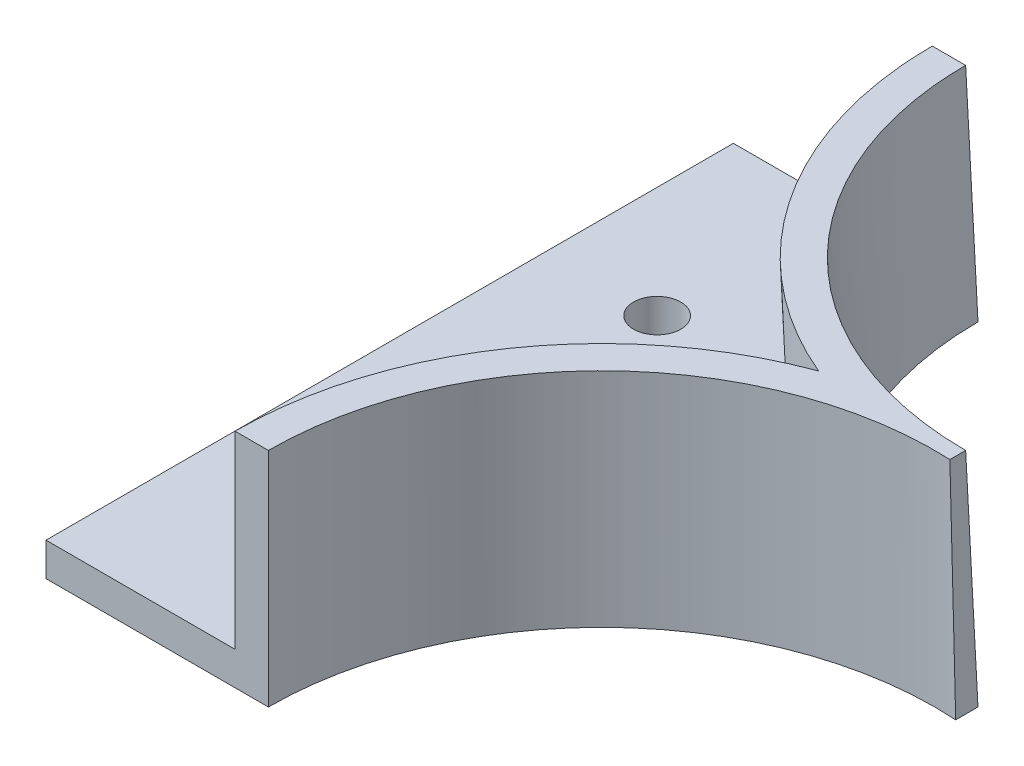
ISO-10303-21;
HEADER;
FILE_DESCRIPTION(('STEP AP214'),'2;1');
FILE_NAME('part.step','',(''),(''),'','','');
FILE_SCHEMA(('AUTOMOTIVE_DESIGN { 1 0 10303 214 1 1 1 1 }'));
ENDSEC;
DATA;
#1=APPLICATION_CONTEXT('core data for automotive mechanical design processes');
#2=APPLICATION_PROTOCOL_DEFINITION('international standard','automotive_design',2000,#1);
#3=PRODUCT_CONTEXT('',#1,'mechanical');
#4=PRODUCT('Part','Part','',(#3));
#5=PRODUCT_RELATED_PRODUCT_CATEGORY('part','',(#4));
#6=PRODUCT_DEFINITION_FORMATION('','',#4);
#7=PRODUCT_DEFINITION_CONTEXT('part definition',#1,'design');
#8=PRODUCT_DEFINITION('design','',#6,#7);
#9=PRODUCT_DEFINITION_SHAPE('','',#8);
#10=(LENGTH_UNIT() NAMED_UNIT(*) SI_UNIT(.MILLI.,.METRE.));
#11=(NAMED_UNIT(*) PLANE_ANGLE_UNIT() SI_UNIT($,.RADIAN.));
#12=(NAMED_UNIT(*) SI_UNIT($,.STERADIAN.) SOLID_ANGLE_UNIT());
#13=UNCERTAINTY_MEASURE_WITH_UNIT(LENGTH_MEASURE(1.E-05),#10,'distance_accuracy_value','');
#14=(GEOMETRIC_REPRESENTATION_CONTEXT(3) GLOBAL_UNCERTAINTY_ASSIGNED_CONTEXT((#13)) GLOBAL_UNIT_ASSIGNED_CONTEXT((#10,
#11,#12)) REPRESENTATION_CONTEXT('',''));
#15=CARTESIAN_POINT('',(0.,0.,0.));
#16=DIRECTION('',(0.,0.,1.));
#17=DIRECTION('',(1.,0.,0.));
#18=AXIS2_PLACEMENT_3D('',#15,#16,#17);
#19=CARTESIAN_POINT('',(0.,70.,-30.));
#20=DIRECTION('',(1.,0.,0.));
#21=DIRECTION('',(0.,0.,-1.));
#22=AXIS2_PLACEMENT_3D('',#19,#20,#21);
#23=PLANE('',#22);
#24=DIRECTION('',(0.,0.,1.));
#25=VECTOR('',#24,1.);
#26=CARTESIAN_POINT('',(0.,3.,-30.));
#27=LINE('',#26,#25);
#28=CARTESIAN_POINT('',(0.,3.,-31.8609469555459));
#29=VERTEX_POINT('',#28);
#30=CARTESIAN_POINT('',(0.,3.,30.));
#31=VERTEX_POINT('',#30);
#32=EDGE_CURVE('E129',#29,#31,#27,.T.);
#33=ORIENTED_EDGE('',*,*,#32,.F.);
#34=DIRECTION('',(0.,0.999614488628896,0.027764619990052));
#35=VECTOR('',#34,1.);
#36=CARTESIAN_POINT('',(0.,70.,-30.));
#37=LINE('',#36,#35);
#38=CARTESIAN_POINT('',(0.,0.,-31.94427293863));
#39=VERTEX_POINT('',#38);
#40=EDGE_CURVE('E178',#29,#39,#37,.F.);
#41=ORIENTED_EDGE('',*,*,#40,.T.);
#42=DIRECTION('',(0.,0.,1.));
#43=VECTOR('',#42,1.);
#44=CARTESIAN_POINT('',(0.,0.,-30.));
#45=LINE('',#44,#43);
#46=CARTESIAN_POINT('',(0.,0.,30.));
#47=VERTEX_POINT('',#46);
#48=EDGE_CURVE('E166',#39,#47,#45,.T.);
#49=ORIENTED_EDGE('',*,*,#48,.T.);
#50=DIRECTION('',(0.,-1.,0.));
#51=VECTOR('',#50,1.);
#52=CARTESIAN_POINT('',(0.,70.,30.));
#53=LINE('',#52,#51);
#54=EDGE_CURVE('E175',#31,#47,#53,.T.);
#55=ORIENTED_EDGE('',*,*,#54,.F.);
#56=EDGE_LOOP('',(#33,#41,#49,#55));
#57=FACE_BOUND('',#56,.T.);
#58=ADVANCED_FACE('F39',(#57),#23,.F.);
#59=CARTESIAN_POINT('',(0.,70.,30.));
#60=DIRECTION('',(0.,0.,-1.));
#61=DIRECTION('',(-1.,0.,0.));
#62=AXIS2_PLACEMENT_3D('',#59,#60,#61);
#63=PLANE('',#62);
#64=DIRECTION('',(0.,1.,0.));
#65=VECTOR('',#64,1.);
#66=CARTESIAN_POINT('',(17.0115608842805,0.,30.));
#67=LINE('',#66,#65);
#68=CARTESIAN_POINT('',(17.0115608842805,3.,30.));
#69=VERTEX_POINT('',#68);
#70=CARTESIAN_POINT('',(17.0115608842805,20.,30.));
#71=VERTEX_POINT('',#70);
#72=EDGE_CURVE('E130',#69,#71,#67,.T.);
#73=ORIENTED_EDGE('',*,*,#72,.F.);
#74=DIRECTION('',(1.,0.,0.));
#75=VECTOR('',#74,1.);
#76=CARTESIAN_POINT('',(0.,3.,30.));
#77=LINE('',#76,#75);
#78=EDGE_CURVE('E210',#31,#69,#77,.T.);
#79=ORIENTED_EDGE('',*,*,#78,.F.);
#80=ORIENTED_EDGE('',*,*,#54,.T.);
#81=DIRECTION('',(1.,0.,0.));
#82=VECTOR('',#81,1.);
#83=CARTESIAN_POINT('',(0.,0.,30.));
#84=LINE('',#83,#82);
#85=CARTESIAN_POINT('',(20.0115608842805,0.,30.));
#86=VERTEX_POINT('',#85);
#87=EDGE_CURVE('E170',#47,#86,#84,.T.);
#88=ORIENTED_EDGE('',*,*,#87,.T.);
#89=DIRECTION('',(0.,1.,0.));
#90=VECTOR('',#89,1.);
#91=CARTESIAN_POINT('',(20.0115608842805,0.,30.));
#92=LINE('',#91,#90);
#93=CARTESIAN_POINT('',(20.0115608842805,20.,30.));
#94=VERTEX_POINT('',#93);
#95=EDGE_CURVE('E155',#86,#94,#92,.T.);
#96=ORIENTED_EDGE('',*,*,#95,.T.);
#97=DIRECTION('',(-1.,0.,0.));
#98=VECTOR('',#97,1.);
#99=CARTESIAN_POINT('',(51.94427293863,20.,30.));
#100=LINE('',#99,#98);
#101=EDGE_CURVE('E62',#94,#71,#100,.T.);
#102=ORIENTED_EDGE('',*,*,#101,.T.);
#103=EDGE_LOOP('',(#73,#79,#80,#88,#96,#102));
#104=FACE_BOUND('',#103,.T.);
#105=ADVANCED_FACE('F206',(#104),#63,.F.);
#106=CARTESIAN_POINT('',(0.,70.,-30.));
#107=DIRECTION('',(0.,0.027764619990052,-0.999614488628895));
#108=DIRECTION('',(0.,0.999614488628896,0.027764619990052));
#109=AXIS2_PLACEMENT_3D('',#106,#107,#108);
#110=PLANE('',#109);
#111=DIRECTION('',(0.0277539246596747,-0.999229422771353,-0.0277539246596747));
#112=VECTOR('',#111,1.);
#113=CARTESIAN_POINT('',(18.3760494120272,20.,-31.3887663847357));
#114=LINE('',#113,#112);
#115=CARTESIAN_POINT('',(18.3760494120272,20.,-31.3887663847357));
#116=VERTEX_POINT('',#115);
#117=CARTESIAN_POINT('',(18.8482299828374,3.,-31.8609469555459));
#118=VERTEX_POINT('',#117);
#119=EDGE_CURVE('E113',#116,#118,#114,.T.);
#120=ORIENTED_EDGE('',*,*,#119,.F.);
#121=DIRECTION('',(-1.,0.,0.));
#122=VECTOR('',#121,1.);
#123=CARTESIAN_POINT('',(51.94427293863,20.,-31.3887663847357));
#124=LINE('',#123,#122);
#125=CARTESIAN_POINT('',(21.3772055004553,20.,-31.3887663847357));
#126=VERTEX_POINT('',#125);
#127=EDGE_CURVE('E124',#126,#116,#124,.T.);
#128=ORIENTED_EDGE('',*,*,#127,.F.);
#129=DIRECTION('',(0.0277539246596747,-0.999229422771353,-0.0277539246596747));
#130=VECTOR('',#129,1.);
#131=CARTESIAN_POINT('',(19.9268255941201,72.2182824367221,-29.9383864784006));
#132=LINE('',#131,#130);
#133=CARTESIAN_POINT('',(21.9327120543495,0.,-31.94427293863));
#134=VERTEX_POINT('',#133);
#135=EDGE_CURVE('E159',#126,#134,#132,.T.);
#136=ORIENTED_EDGE('',*,*,#135,.T.);
#137=DIRECTION('',(1.,0.,0.));
#138=VECTOR('',#137,1.);
#139=CARTESIAN_POINT('',(0.,0.,-31.94427293863));
#140=LINE('',#139,#138);
#141=EDGE_CURVE('E181',#134,#39,#140,.F.);
#142=ORIENTED_EDGE('',*,*,#141,.T.);
#143=ORIENTED_EDGE('',*,*,#40,.F.);
#144=DIRECTION('',(1.,0.,0.));
#145=VECTOR('',#144,1.);
#146=CARTESIAN_POINT('',(0.,3.,-31.8609469555459));
#147=LINE('',#146,#145);
#148=EDGE_CURVE('E127',#118,#29,#147,.F.);
#149=ORIENTED_EDGE('',*,*,#148,.F.);
#150=EDGE_LOOP('',(#120,#128,#136,#142,#143,#149));
#151=FACE_BOUND('',#150,.T.);
#152=ADVANCED_FACE('F41',(#151),#110,.T.);
#153=CARTESIAN_POINT('',(51.94427293863,20.,30.));
#154=DIRECTION('',(0.,-1.,0.));
#155=DIRECTION('',(0.,0.,-1.));
#156=AXIS2_PLACEMENT_3D('',#153,#154,#155);
#157=PLANE('',#156);
#158=CARTESIAN_POINT('',(51.3887663847357,20.,-31.3887663847357));
#159=DIRECTION('',(0.,-1.,0.));
#160=DIRECTION('',(0.707106781186546,0.,-0.707106781186549));
#161=AXIS2_PLACEMENT_3D('',#158,#159,#160);
#162=ELLIPSE('',#161,33.0254486587023,33.);
#163=CARTESIAN_POINT('',(38.5846404528198,20.,-0.950390655048896));
#164=VERTEX_POINT('',#163);
#165=EDGE_CURVE('E109',#116,#164,#162,.F.);
#166=ORIENTED_EDGE('',*,*,#165,.T.);
#167=CARTESIAN_POINT('',(50.,20.,30.));
#168=DIRECTION('',(0.,-1.,0.));
#169=DIRECTION('',(0.,0.,-1.));
#170=AXIS2_PLACEMENT_3D('',#167,#168,#169);
#171=CIRCLE('',#170,32.9884391157195);
#172=EDGE_CURVE('E55',#164,#71,#171,.F.);
#173=ORIENTED_EDGE('',*,*,#172,.T.);
#174=ORIENTED_EDGE('',*,*,#101,.F.);
#175=CARTESIAN_POINT('',(50.,20.,30.));
#176=DIRECTION('',(0.,-1.,0.));
#177=DIRECTION('',(0.,0.,-1.));
#178=AXIS2_PLACEMENT_3D('',#175,#176,#177);
#179=CIRCLE('',#178,29.9884391157195);
#180=CARTESIAN_POINT('',(51.3887663847357,20.,0.0437350705091051));
#181=VERTEX_POINT('',#180);
#182=EDGE_CURVE('E11',#181,#94,#179,.F.);
#183=ORIENTED_EDGE('',*,*,#182,.F.);
#184=DIRECTION('',(0.,0.,-1.));
#185=VECTOR('',#184,1.);
#186=CARTESIAN_POINT('',(51.3887663847357,20.,-30.));
#187=LINE('',#186,#185);
#188=CARTESIAN_POINT('',(51.3887663847357,20.,-1.37720550045527));
#189=VERTEX_POINT('',#188);
#190=EDGE_CURVE('E139',#189,#181,#187,.F.);
#191=ORIENTED_EDGE('',*,*,#190,.F.);
#192=CARTESIAN_POINT('',(51.3887663847357,20.,-31.3887663847357));
#193=DIRECTION('',(0.,-1.,0.));
#194=DIRECTION('',(0.707106781186546,0.,-0.707106781186549));
#195=AXIS2_PLACEMENT_3D('',#192,#193,#194);
#196=ELLIPSE('',#195,30.0231351442748,30.);
#197=EDGE_CURVE('E134',#126,#189,#196,.F.);
#198=ORIENTED_EDGE('',*,*,#197,.F.);
#199=ORIENTED_EDGE('',*,*,#127,.T.);
#200=EDGE_LOOP('',(#166,#173,#174,#183,#191,#198,#199));
#201=FACE_BOUND('',#200,.T.);
#202=ADVANCED_FACE('F132',(#201),#157,.F.);
#203=CARTESIAN_POINT('',(50.,70.,-30.));
#204=DIRECTION('',(0.999614488628895,0.027764619990052,0.));
#205=DIRECTION('',(-0.027764619990052,0.999614488628896,0.));
#206=AXIS2_PLACEMENT_3D('',#203,#204,#205);
#207=PLANE('',#206);
#208=DIRECTION('',(0.0277539246596747,-0.999229422771353,-0.0277539246596747));
#209=VECTOR('',#208,1.);
#210=CARTESIAN_POINT('',(49.9383864784006,72.2182824367221,0.0731744058798355));
#211=LINE('',#210,#209);
#212=CARTESIAN_POINT('',(51.94427293863,0.,-1.93271205434957));
#213=VERTEX_POINT('',#212);
#214=EDGE_CURVE('E162',#213,#189,#211,.F.);
#215=ORIENTED_EDGE('',*,*,#214,.T.);
#216=ORIENTED_EDGE('',*,*,#190,.T.);
#217=CARTESIAN_POINT('',(50.,70.,30.));
#218=DIRECTION('',(0.999614488628895,0.027764619990052,0.));
#219=DIRECTION('',(-0.027764619990052,0.999614488628896,0.));
#220=AXIS2_PLACEMENT_3D('',#217,#218,#219);
#221=ELLIPSE('',#220,1080.09542815512,29.9884391157195);
#222=CARTESIAN_POINT('',(51.94427293863,0.,0.0746548334471311));
#223=VERTEX_POINT('',#222);
#224=EDGE_CURVE('E152',#181,#223,#221,.F.);
#225=ORIENTED_EDGE('',*,*,#224,.T.);
#226=DIRECTION('',(0.,0.,1.));
#227=VECTOR('',#226,1.);
#228=CARTESIAN_POINT('',(51.94427293863,0.,-30.));
#229=LINE('',#228,#227);
#230=EDGE_CURVE('E174',#223,#213,#229,.F.);
#231=ORIENTED_EDGE('',*,*,#230,.T.);
#232=EDGE_LOOP('',(#215,#216,#225,#231));
#233=FACE_BOUND('',#232,.T.);
#234=ADVANCED_FACE('F198',(#233),#207,.T.);
#235=CARTESIAN_POINT('',(0.,0.,0.));
#236=DIRECTION('',(0.,1.,0.));
#237=DIRECTION('',(0.,0.,1.));
#238=AXIS2_PLACEMENT_3D('',#235,#236,#237);
#239=PLANE('',#238);
#240=CARTESIAN_POINT('',(10.,0.,-15.));
#241=DIRECTION('',(0.,1.,0.));
#242=DIRECTION('',(0.,0.,1.));
#243=AXIS2_PLACEMENT_3D('',#240,#241,#242);
#244=CIRCLE('',#243,2.125);
#245=CARTESIAN_POINT('',(10.,0.,-12.875));
#246=VERTEX_POINT('',#245);
#247=EDGE_CURVE('E119',#246,#246,#244,.T.);
#248=ORIENTED_EDGE('',*,*,#247,.T.);
#249=EDGE_LOOP('',(#248));
#250=FACE_BOUND('',#249,.T.);
#251=CARTESIAN_POINT('',(10.,0.,15.));
#252=DIRECTION('',(0.,1.,0.));
#253=DIRECTION('',(0.,0.,-1.));
#254=AXIS2_PLACEMENT_3D('',#251,#252,#253);
#255=CIRCLE('',#254,2.125);
#256=CARTESIAN_POINT('',(10.,0.,12.875));
#257=VERTEX_POINT('',#256);
#258=EDGE_CURVE('E347',#257,#257,#255,.T.);
#259=ORIENTED_EDGE('',*,*,#258,.T.);
#260=EDGE_LOOP('',(#259));
#261=FACE_BOUND('',#260,.T.);
#262=ORIENTED_EDGE('',*,*,#230,.F.);
#263=CARTESIAN_POINT('',(50.,0.,30.));
#264=DIRECTION('',(0.,1.,0.));
#265=DIRECTION('',(0.,0.,1.));
#266=AXIS2_PLACEMENT_3D('',#263,#264,#265);
#267=CIRCLE('',#266,29.9884391157195);
#268=EDGE_CURVE('E148',#223,#86,#267,.T.);
#269=ORIENTED_EDGE('',*,*,#268,.T.);
#270=ORIENTED_EDGE('',*,*,#87,.F.);
#271=ORIENTED_EDGE('',*,*,#48,.F.);
#272=ORIENTED_EDGE('',*,*,#141,.F.);
#273=CARTESIAN_POINT('',(51.94427293863,0.,-31.94427293863));
#274=DIRECTION('',(0.,1.,0.));
#275=DIRECTION('',(0.707106781186548,0.,-0.707106781186548));
#276=AXIS2_PLACEMENT_3D('',#273,#274,#275);
#277=ELLIPSE('',#276,30.0231351442748,30.);
#278=EDGE_CURVE('E48',#134,#213,#277,.T.);
#279=ORIENTED_EDGE('',*,*,#278,.T.);
#280=EDGE_LOOP('',(#262,#269,#270,#271,#272,#279));
#281=FACE_BOUND('',#280,.T.);
#282=ADVANCED_FACE('F192',(#250,#261,#281),#239,.F.);
#283=CARTESIAN_POINT('',(49.9152691632584,73.0505791929059,-29.9152691632584));
#284=DIRECTION('',(0.0277539246596747,-0.999229422771353,-0.0277539246596747));
#285=DIRECTION('',(0.,0.027764619990052,-0.999614488628895));
#286=AXIS2_PLACEMENT_3D('',#283,#284,#285);
#287=CYLINDRICAL_SURFACE('',#286,30.);
#288=ORIENTED_EDGE('',*,*,#135,.F.);
#289=ORIENTED_EDGE('',*,*,#197,.T.);
#290=ORIENTED_EDGE('',*,*,#214,.F.);
#291=ORIENTED_EDGE('',*,*,#278,.F.);
#292=EDGE_LOOP('',(#288,#289,#290,#291));
#293=FACE_BOUND('',#292,.T.);
#294=ADVANCED_FACE('F196',(#293),#287,.F.);
#295=CARTESIAN_POINT('',(50.,0.,30.));
#296=DIRECTION('',(0.,1.,0.));
#297=DIRECTION('',(0.,0.,1.));
#298=AXIS2_PLACEMENT_3D('',#295,#296,#297);
#299=CYLINDRICAL_SURFACE('',#298,29.9884391157195);
#300=ORIENTED_EDGE('',*,*,#224,.F.);
#301=ORIENTED_EDGE('',*,*,#182,.T.);
#302=ORIENTED_EDGE('',*,*,#95,.F.);
#303=ORIENTED_EDGE('',*,*,#268,.F.);
#304=EDGE_LOOP('',(#300,#301,#302,#303));
#305=FACE_BOUND('',#304,.T.);
#306=ADVANCED_FACE('F202',(#305),#299,.F.);
#307=CARTESIAN_POINT('',(0.,3.,0.));
#308=DIRECTION('',(0.,1.,0.));
#309=DIRECTION('',(0.,0.,1.));
#310=AXIS2_PLACEMENT_3D('',#307,#308,#309);
#311=PLANE('',#310);
#312=CARTESIAN_POINT('',(10.,3.,-15.));
#313=DIRECTION('',(0.,1.,0.));
#314=DIRECTION('',(0.,0.,1.));
#315=AXIS2_PLACEMENT_3D('',#312,#313,#314);
#316=CIRCLE('',#315,2.125);
#317=CARTESIAN_POINT('',(10.,3.,-12.875));
#318=VERTEX_POINT('',#317);
#319=EDGE_CURVE('E345',#318,#318,#316,.T.);
#320=ORIENTED_EDGE('',*,*,#319,.F.);
#321=EDGE_LOOP('',(#320));
#322=FACE_BOUND('',#321,.T.);
#323=CARTESIAN_POINT('',(10.,3.,15.));
#324=DIRECTION('',(0.,1.,0.));
#325=DIRECTION('',(0.,0.,-1.));
#326=AXIS2_PLACEMENT_3D('',#323,#324,#325);
#327=CIRCLE('',#326,2.125);
#328=CARTESIAN_POINT('',(10.,3.,12.875));
#329=VERTEX_POINT('',#328);
#330=EDGE_CURVE('E353',#329,#329,#327,.T.);
#331=ORIENTED_EDGE('',*,*,#330,.F.);
#332=EDGE_LOOP('',(#331));
#333=FACE_BOUND('',#332,.T.);
#334=CARTESIAN_POINT('',(51.8609469555459,3.,-31.8609469555459));
#335=DIRECTION('',(0.,1.,0.));
#336=DIRECTION('',(0.707106781186548,0.,-0.707106781186548));
#337=AXIS2_PLACEMENT_3D('',#334,#335,#336);
#338=ELLIPSE('',#337,33.0254486587023,33.);
#339=CARTESIAN_POINT('',(39.4559923788158,3.,-1.25797527953377));
#340=VERTEX_POINT('',#339);
#341=EDGE_CURVE('E223',#118,#340,#338,.T.);
#342=ORIENTED_EDGE('',*,*,#341,.F.);
#343=ORIENTED_EDGE('',*,*,#148,.T.);
#344=ORIENTED_EDGE('',*,*,#32,.T.);
#345=ORIENTED_EDGE('',*,*,#78,.T.);
#346=CARTESIAN_POINT('',(50.,3.,30.));
#347=DIRECTION('',(0.,1.,0.));
#348=DIRECTION('',(0.,0.,1.));
#349=AXIS2_PLACEMENT_3D('',#346,#347,#348);
#350=CIRCLE('',#349,32.9884391157195);
#351=EDGE_CURVE('E118',#340,#69,#350,.T.);
#352=ORIENTED_EDGE('',*,*,#351,.F.);
#353=EDGE_LOOP('',(#342,#343,#344,#345,#352));
#354=FACE_BOUND('',#353,.T.);
#355=ADVANCED_FACE('F241',(#322,#333,#354),#311,.T.);
#356=CARTESIAN_POINT('',(49.9152691632584,73.0505791929059,-29.9152691632584));
#357=DIRECTION('',(0.0277539246596747,-0.999229422771353,-0.0277539246596747));
#358=DIRECTION('',(0.,0.027764619990052,-0.999614488628895));
#359=AXIS2_PLACEMENT_3D('',#356,#357,#358);
#360=CYLINDRICAL_SURFACE('',#359,33.);
#361=ORIENTED_EDGE('',*,*,#165,.F.);
#362=ORIENTED_EDGE('',*,*,#119,.T.);
#363=ORIENTED_EDGE('',*,*,#341,.T.);
#364=CARTESIAN_POINT('',(36.9067336664537,55.1407990654369,-0.278763052845456));
#365=CARTESIAN_POINT('',(37.1744256997204,49.2834911043279,-0.394478289265437));
#366=CARTESIAN_POINT('',(37.4474994801779,43.4263897624306,-0.508388459218252));
#367=CARTESIAN_POINT('',(38.0062035366227,31.712752537826,-0.732347702015418));
#368=CARTESIAN_POINT('',(38.2918337276976,25.8562166515631,-0.842396800961084));
#369=CARTESIAN_POINT('',(38.8774477080724,14.1437727456818,-1.05838470466095));
#370=CARTESIAN_POINT('',(39.1774315233587,8.28786472721931,-1.16432350197304));
#371=CARTESIAN_POINT('',(39.6400835209334,-0.495407771098598,-1.31989297306164));
#372=CARTESIAN_POINT('',(39.7964141244727,-3.42307706768287,-1.37119317970061));
#373=CARTESIAN_POINT('',(40.1137174220698,-9.27818559702827,-1.47262629926076));
#374=CARTESIAN_POINT('',(40.2746901183326,-12.2056248296795,-1.52275921162749));
#375=CARTESIAN_POINT('',(40.4381922673208,-15.1329342152786,-1.57228132673993));
#376=B_SPLINE_CURVE_WITH_KNOTS('',3,(#364,#365,#366,#367,#368,#369,#370,#371,#372,#373,#374,
#375),.UNSPECIFIED.,.F.,.F.,(4,2,2,2,2,4),(0.,17.5936930563292,35.1872671542011,
52.7808731054636,61.5777364947754,70.3746040624408),.UNSPECIFIED.);
#377=EDGE_CURVE('E115',#164,#340,#376,.T.);
#378=ORIENTED_EDGE('',*,*,#377,.F.);
#379=EDGE_LOOP('',(#361,#362,#363,#378));
#380=FACE_BOUND('',#379,.T.);
#381=ADVANCED_FACE('F111',(#380),#360,.T.);
#382=CARTESIAN_POINT('',(50.,0.,30.));
#383=DIRECTION('',(0.,1.,0.));
#384=DIRECTION('',(0.,0.,1.));
#385=AXIS2_PLACEMENT_3D('',#382,#383,#384);
#386=CYLINDRICAL_SURFACE('',#385,32.9884391157195);
#387=ORIENTED_EDGE('',*,*,#377,.T.);
#388=ORIENTED_EDGE('',*,*,#351,.T.);
#389=ORIENTED_EDGE('',*,*,#72,.T.);
#390=ORIENTED_EDGE('',*,*,#172,.F.);
#391=EDGE_LOOP('',(#387,#388,#389,#390));
#392=FACE_BOUND('',#391,.T.);
#393=ADVANCED_FACE('F232',(#392),#386,.T.);
#394=CARTESIAN_POINT('',(10.,0.,15.));
#395=DIRECTION('',(0.,1.,0.));
#396=DIRECTION('',(0.,0.,1.));
#397=AXIS2_PLACEMENT_3D('',#394,#395,#396);
#398=CYLINDRICAL_SURFACE('',#397,2.125);
#399=ORIENTED_EDGE('',*,*,#258,.F.);
#400=EDGE_LOOP('',(#399));
#401=FACE_BOUND('',#400,.T.);
#402=ORIENTED_EDGE('',*,*,#330,.T.);
#403=EDGE_LOOP('',(#402));
#404=FACE_BOUND('',#403,.T.);
#405=ADVANCED_FACE('F236',(#401,#404),#398,.F.);
#406=CARTESIAN_POINT('',(10.,0.,-15.));
#407=DIRECTION('',(0.,1.,0.));
#408=DIRECTION('',(0.,0.,1.));
#409=AXIS2_PLACEMENT_3D('',#406,#407,#408);
#410=CYLINDRICAL_SURFACE('',#409,2.125);
#411=ORIENTED_EDGE('',*,*,#247,.F.);
#412=EDGE_LOOP('',(#411));
#413=FACE_BOUND('',#412,.T.);
#414=ORIENTED_EDGE('',*,*,#319,.T.);
#415=EDGE_LOOP('',(#414));
#416=FACE_BOUND('',#415,.T.);
#417=ADVANCED_FACE('F290',(#413,#416),#410,.F.);
#418=CLOSED_SHELL('',(#58,#105,#152,#202,#234,#282,#294,#306,#355,#381,#393,#405,#417));
#419=MANIFOLD_SOLID_BREP('B2',#418);
#420=ADVANCED_BREP_SHAPE_REPRESENTATION('',(#18,#419),#14);
#421=SHAPE_DEFINITION_REPRESENTATION(#9,#420);
ENDSEC;
END-ISO-10303-21;
